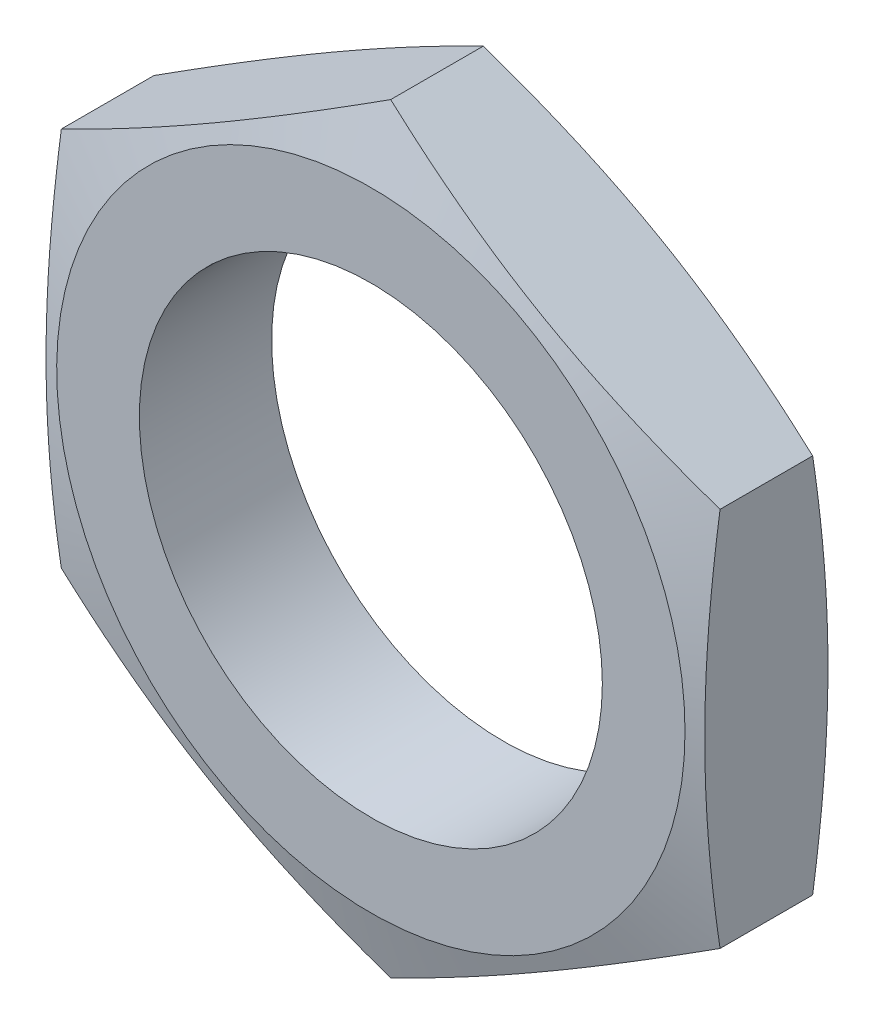
ISO-10303-21;
HEADER;
FILE_DESCRIPTION(('STEP AP214'),'2;1');
FILE_NAME('part.step','',(''),(''),'','','');
FILE_SCHEMA(('AUTOMOTIVE_DESIGN { 1 0 10303 214 1 1 1 1 }'));
ENDSEC;
DATA;
#1=APPLICATION_CONTEXT('core data for automotive mechanical design processes');
#2=APPLICATION_PROTOCOL_DEFINITION('international standard','automotive_design',2000,#1);
#3=PRODUCT_CONTEXT('',#1,'mechanical');
#4=PRODUCT('Part','Part','',(#3));
#5=PRODUCT_RELATED_PRODUCT_CATEGORY('part','',(#4));
#6=PRODUCT_DEFINITION_FORMATION('','',#4);
#7=PRODUCT_DEFINITION_CONTEXT('part definition',#1,'design');
#8=PRODUCT_DEFINITION('design','',#6,#7);
#9=PRODUCT_DEFINITION_SHAPE('','',#8);
#10=(LENGTH_UNIT() NAMED_UNIT(*) SI_UNIT(.MILLI.,.METRE.));
#11=(NAMED_UNIT(*) PLANE_ANGLE_UNIT() SI_UNIT($,.RADIAN.));
#12=(NAMED_UNIT(*) SI_UNIT($,.STERADIAN.) SOLID_ANGLE_UNIT());
#13=UNCERTAINTY_MEASURE_WITH_UNIT(LENGTH_MEASURE(1.E-05),#10,'distance_accuracy_value','');
#14=(GEOMETRIC_REPRESENTATION_CONTEXT(3) GLOBAL_UNCERTAINTY_ASSIGNED_CONTEXT((#13)) GLOBAL_UNIT_ASSIGNED_CONTEXT((#10,
#11,#12)) REPRESENTATION_CONTEXT('',''));
#15=CARTESIAN_POINT('',(0.,0.,0.));
#16=DIRECTION('',(0.,0.,1.));
#17=DIRECTION('',(1.,0.,0.));
#18=AXIS2_PLACEMENT_3D('',#15,#16,#17);
#19=CARTESIAN_POINT('',(15.0572369308232,12.6907672161525,9.1));
#20=DIRECTION('',(0.,0.,1.));
#21=DIRECTION('',(1.,0.,0.));
#22=AXIS2_PLACEMENT_3D('',#19,#20,#21);
#23=CYLINDRICAL_SURFACE('',#22,3.5);
#24=CARTESIAN_POINT('',(15.0572369308232,12.6907672161525,9.1));
#25=DIRECTION('',(0.,0.,1.));
#26=DIRECTION('',(1.,0.,0.));
#27=AXIS2_PLACEMENT_3D('',#24,#25,#26);
#28=CIRCLE('',#27,3.5);
#29=CARTESIAN_POINT('',(18.5572369308232,12.6907672161525,9.1));
#30=VERTEX_POINT('',#29);
#31=EDGE_CURVE('E10',#30,#30,#28,.T.);
#32=ORIENTED_EDGE('',*,*,#31,.T.);
#33=EDGE_LOOP('',(#32));
#34=FACE_BOUND('',#33,.T.);
#35=CARTESIAN_POINT('',(15.0572369308232,12.6907672161525,7.1));
#36=DIRECTION('',(0.,0.,1.));
#37=DIRECTION('',(1.,0.,0.));
#38=AXIS2_PLACEMENT_3D('',#35,#36,#37);
#39=CIRCLE('',#38,3.5);
#40=CARTESIAN_POINT('',(18.5572369308232,12.6907672161525,7.1));
#41=VERTEX_POINT('',#40);
#42=EDGE_CURVE('E94',#41,#41,#39,.T.);
#43=ORIENTED_EDGE('',*,*,#42,.F.);
#44=EDGE_LOOP('',(#43));
#45=FACE_BOUND('',#44,.T.);
#46=ADVANCED_FACE('F16',(#34,#45),#23,.F.);
#47=CARTESIAN_POINT('',(15.0572369308232,12.6907672161525,7.1));
#48=DIRECTION('',(0.,0.,1.));
#49=DIRECTION('',(1.,0.,0.));
#50=AXIS2_PLACEMENT_3D('',#47,#48,#49);
#51=CONICAL_SURFACE('',#50,4.75,1.27933953231703);
#52=CARTESIAN_POINT('',(20.0368830025837,9.81576721615255,7.4));
#53=CARTESIAN_POINT('',(20.0368830025837,10.0543501569726,7.36419951283469));
#54=CARTESIAN_POINT('',(20.0368830025837,10.2934729783412,7.33167882920841));
#55=CARTESIAN_POINT('',(20.0368830025837,10.7727764219852,7.27451936130639));
#56=CARTESIAN_POINT('',(20.0368830025837,11.0129575253882,7.249884642703));
#57=CARTESIAN_POINT('',(20.0368830025837,11.4925566809583,7.20998819620959));
#58=CARTESIAN_POINT('',(20.0368830025837,11.7319696503819,7.19466698976845));
#59=CARTESIAN_POINT('',(20.0368830025837,12.2111775576457,7.17412104518378));
#60=CARTESIAN_POINT('',(20.0368830025837,12.4509723868991,7.16889382152815));
#61=CARTESIAN_POINT('',(20.0368830025837,12.9305620454059,7.16889382152815));
#62=CARTESIAN_POINT('',(20.0368830025837,13.1703568746594,7.17412104518378));
#63=CARTESIAN_POINT('',(20.0368830025837,13.6495647819231,7.19466698976845));
#64=CARTESIAN_POINT('',(20.0368830025837,13.8889777513468,7.20998819620959));
#65=CARTESIAN_POINT('',(20.0368830025837,14.3685769069169,7.249884642703));
#66=CARTESIAN_POINT('',(20.0368830025837,14.6087580103199,7.27451936130639));
#67=CARTESIAN_POINT('',(20.0368830025837,15.0880614539639,7.33167882920841));
#68=CARTESIAN_POINT('',(20.0368830025837,15.3271842753325,7.36419951283469));
#69=CARTESIAN_POINT('',(20.0368830025837,15.5657672161526,7.4));
#70=B_SPLINE_CURVE_WITH_KNOTS('',3,(#52,#53,#54,#55,#56,#57,#58,#59,#60,#61,#62,#63,#64,#65,#66,
#67,#68,#69),.UNSPECIFIED.,.F.,.F.,(4,2,2,2,2,2,2,2,4),(0.,0.723810511300975,1.44799359013895,
2.16750187913838,2.88683297596828,3.60616407279821,4.32567236179767,5.04985544063567,
5.77366595193667),.UNSPECIFIED.);
#71=CARTESIAN_POINT('',(20.0368830025837,9.81576721615255,7.4));
#72=VERTEX_POINT('',#71);
#73=CARTESIAN_POINT('',(20.0368830025837,15.5657672161526,7.4));
#74=VERTEX_POINT('',#73);
#75=EDGE_CURVE('E88',#72,#74,#70,.T.);
#76=ORIENTED_EDGE('',*,*,#75,.F.);
#77=CARTESIAN_POINT('',(15.0572369308232,6.9407672161525,7.4));
#78=CARTESIAN_POINT('',(15.263855818483,7.06005868656255,7.36419951283469));
#79=CARTESIAN_POINT('',(15.4709422564128,7.17962009724684,7.33167882920841));
#80=CARTESIAN_POINT('',(15.8860312147298,7.41927181906883,7.27451936130639));
#81=CARTESIAN_POINT('',(16.0940341517858,7.53936237077034,7.249884642703));
#82=CARTESIAN_POINT('',(16.5093792041431,7.77916194855538,7.20998819620959));
#83=CARTESIAN_POINT('',(16.7167169176594,7.89886843326721,7.19466698976845));
#84=CARTESIAN_POINT('',(17.1317231390442,8.1384723868991,7.17412104518378));
#85=CARTESIAN_POINT('',(17.3393915528739,8.25836980152582,7.16889382152815));
#86=CARTESIAN_POINT('',(17.7547283805331,8.49816463077924,7.16889382152815));
#87=CARTESIAN_POINT('',(17.9623967943627,8.61806204540595,7.17412104518378));
#88=CARTESIAN_POINT('',(18.3774030157475,8.85766599903785,7.19466698976845));
#89=CARTESIAN_POINT('',(18.5847407292639,8.97737248374968,7.20998819620959));
#90=CARTESIAN_POINT('',(19.0000857816211,9.21717206153472,7.249884642703));
#91=CARTESIAN_POINT('',(19.2080887186771,9.33726261323623,7.27451936130639));
#92=CARTESIAN_POINT('',(19.6231776769941,9.57691433505822,7.33167882920841));
#93=CARTESIAN_POINT('',(19.8302641149239,9.69647574574251,7.36419951283469));
#94=CARTESIAN_POINT('',(20.0368830025837,9.81576721615255,7.4));
#95=B_SPLINE_CURVE_WITH_KNOTS('',3,(#77,#78,#79,#80,#81,#82,#83,#84,#85,#86,#87,#88,#89,#90,#91,
#92,#93,#94),.UNSPECIFIED.,.F.,.F.,(4,2,2,2,2,2,2,2,4),(0.,0.723810511300989,1.44799359013897,
2.16750187913842,2.88683297596834,3.60616407279826,4.3256723617977,5.04985544063568,
5.77366595193668),.UNSPECIFIED.);
#96=CARTESIAN_POINT('',(15.0572369308232,6.9407672161525,7.4));
#97=VERTEX_POINT('',#96);
#98=EDGE_CURVE('E100',#97,#72,#95,.T.);
#99=ORIENTED_EDGE('',*,*,#98,.F.);
#100=CARTESIAN_POINT('',(10.0775908590627,9.81576721615248,7.4));
#101=CARTESIAN_POINT('',(10.2842097467225,9.69647574574244,7.36419951283469));
#102=CARTESIAN_POINT('',(10.4912961846522,9.57691433505816,7.33167882920841));
#103=CARTESIAN_POINT('',(10.9063851429693,9.33726261323617,7.27451936130639));
#104=CARTESIAN_POINT('',(11.1143880800253,9.21717206153466,7.249884642703));
#105=CARTESIAN_POINT('',(11.5297331323825,8.97737248374963,7.20998819620959));
#106=CARTESIAN_POINT('',(11.7370708458989,8.8576659990378,7.19466698976845));
#107=CARTESIAN_POINT('',(12.1520770672837,8.61806204540591,7.17412104518378));
#108=CARTESIAN_POINT('',(12.3597454811133,8.4981646307792,7.16889382152815));
#109=CARTESIAN_POINT('',(12.7750823087726,8.25836980152578,7.16889382152815));
#110=CARTESIAN_POINT('',(12.9827507226022,8.13847238689907,7.17412104518378));
#111=CARTESIAN_POINT('',(13.397756943987,7.89886843326718,7.19466698976845));
#112=CARTESIAN_POINT('',(13.6050946575033,7.77916194855536,7.20998819620959));
#113=CARTESIAN_POINT('',(14.0204397098606,7.53936237077032,7.249884642703));
#114=CARTESIAN_POINT('',(14.2284426469166,7.41927181906882,7.27451936130639));
#115=CARTESIAN_POINT('',(14.6435316052336,7.17962009724683,7.33167882920841));
#116=CARTESIAN_POINT('',(14.8506180431634,7.06005868656254,7.36419951283469));
#117=CARTESIAN_POINT('',(15.0572369308232,6.9407672161525,7.4));
#118=B_SPLINE_CURVE_WITH_KNOTS('',3,(#100,#101,#102,#103,#104,#105,#106,#107,#108,#109,#110,
#111,#112,#113,#114,#115,#116,#117),.UNSPECIFIED.,.F.,.F.,(4,2,2,2,2,2,2,2,4),(0.,
0.723810511300987,1.44799359013897,2.16750187913842,2.88683297596834,3.60616407279826,
4.3256723617977,5.04985544063569,5.77366595193667),.UNSPECIFIED.);
#119=CARTESIAN_POINT('',(10.0775908590627,9.81576721615248,7.4));
#120=VERTEX_POINT('',#119);
#121=EDGE_CURVE('E111',#120,#97,#118,.T.);
#122=ORIENTED_EDGE('',*,*,#121,.F.);
#123=CARTESIAN_POINT('',(10.0775908590626,15.5657672161525,7.4));
#124=CARTESIAN_POINT('',(10.0775908590626,15.3271842753324,7.36419951283469));
#125=CARTESIAN_POINT('',(10.0775908590626,15.0880614539638,7.33167882920841));
#126=CARTESIAN_POINT('',(10.0775908590626,14.6087580103199,7.27451936130639));
#127=CARTESIAN_POINT('',(10.0775908590626,14.3685769069169,7.249884642703));
#128=CARTESIAN_POINT('',(10.0775908590626,13.8889777513468,7.20998819620959));
#129=CARTESIAN_POINT('',(10.0775908590626,13.6495647819231,7.19466698976845));
#130=CARTESIAN_POINT('',(10.0775908590627,13.1703568746593,7.17412104518378));
#131=CARTESIAN_POINT('',(10.0775908590627,12.9305620454059,7.16889382152815));
#132=CARTESIAN_POINT('',(10.0775908590627,12.4509723868991,7.16889382152815));
#133=CARTESIAN_POINT('',(10.0775908590627,12.2111775576457,7.17412104518377));
#134=CARTESIAN_POINT('',(10.0775908590627,11.7319696503819,7.19466698976845));
#135=CARTESIAN_POINT('',(10.0775908590627,11.4925566809582,7.20998819620959));
#136=CARTESIAN_POINT('',(10.0775908590627,11.0129575253881,7.249884642703));
#137=CARTESIAN_POINT('',(10.0775908590627,10.7727764219851,7.27451936130639));
#138=CARTESIAN_POINT('',(10.0775908590627,10.2934729783411,7.33167882920841));
#139=CARTESIAN_POINT('',(10.0775908590627,10.0543501569726,7.36419951283469));
#140=CARTESIAN_POINT('',(10.0775908590627,9.81576721615248,7.4));
#141=B_SPLINE_CURVE_WITH_KNOTS('',3,(#123,#124,#125,#126,#127,#128,#129,#130,#131,#132,#133,
#134,#135,#136,#137,#138,#139,#140),.UNSPECIFIED.,.F.,.F.,(4,2,2,2,2,2,2,2,4),(0.,
0.723810511300984,1.44799359013896,2.1675018791384,2.88683297596831,3.60616407279824,
4.32567236179769,5.04985544063568,5.77366595193667),.UNSPECIFIED.);
#142=CARTESIAN_POINT('',(10.0775908590626,15.5657672161525,7.4));
#143=VERTEX_POINT('',#142);
#144=EDGE_CURVE('E116',#143,#120,#141,.T.);
#145=ORIENTED_EDGE('',*,*,#144,.F.);
#146=CARTESIAN_POINT('',(15.0572369308232,18.4407672161525,7.4));
#147=CARTESIAN_POINT('',(14.8506180431634,18.3214757457425,7.36419951283469));
#148=CARTESIAN_POINT('',(14.6435316052336,18.2019143350582,7.33167882920841));
#149=CARTESIAN_POINT('',(14.2284426469165,17.9622626132362,7.27451936130639));
#150=CARTESIAN_POINT('',(14.0204397098606,17.8421720615347,7.249884642703));
#151=CARTESIAN_POINT('',(13.6050946575033,17.6023724837496,7.20998819620959));
#152=CARTESIAN_POINT('',(13.3977569439869,17.4826659990378,7.19466698976845));
#153=CARTESIAN_POINT('',(12.9827507226021,17.2430620454059,7.17412104518377));
#154=CARTESIAN_POINT('',(12.7750823087725,17.1231646307792,7.16889382152815));
#155=CARTESIAN_POINT('',(12.3597454811133,16.8833698015258,7.16889382152815));
#156=CARTESIAN_POINT('',(12.1520770672837,16.7634723868991,7.17412104518377));
#157=CARTESIAN_POINT('',(11.7370708458989,16.5238684332672,7.19466698976845));
#158=CARTESIAN_POINT('',(11.5297331323825,16.4041619485554,7.20998819620959));
#159=CARTESIAN_POINT('',(11.1143880800253,16.1643623707703,7.249884642703));
#160=CARTESIAN_POINT('',(10.9063851429693,16.0442718190688,7.27451936130639));
#161=CARTESIAN_POINT('',(10.4912961846522,15.8046200972468,7.33167882920841));
#162=CARTESIAN_POINT('',(10.2842097467224,15.6850586865625,7.36419951283469));
#163=CARTESIAN_POINT('',(10.0775908590626,15.5657672161525,7.4));
#164=B_SPLINE_CURVE_WITH_KNOTS('',3,(#146,#147,#148,#149,#150,#151,#152,#153,#154,#155,#156,
#157,#158,#159,#160,#161,#162,#163),.UNSPECIFIED.,.F.,.F.,(4,2,2,2,2,2,2,2,4),(0.,
0.723810511300988,1.44799359013897,2.16750187913842,2.88683297596833,3.60616407279826,
4.3256723617977,5.04985544063569,5.77366595193667),.UNSPECIFIED.);
#165=CARTESIAN_POINT('',(15.0572369308232,18.4407672161525,7.4));
#166=VERTEX_POINT('',#165);
#167=EDGE_CURVE('E21',#166,#143,#164,.T.);
#168=ORIENTED_EDGE('',*,*,#167,.F.);
#169=CARTESIAN_POINT('',(20.0368830025837,15.5657672161526,7.4));
#170=CARTESIAN_POINT('',(19.8302641149239,15.6850586865626,7.36419951283469));
#171=CARTESIAN_POINT('',(19.6231776769941,15.8046200972469,7.33167882920841));
#172=CARTESIAN_POINT('',(19.208088718677,16.0442718190689,7.27451936130639));
#173=CARTESIAN_POINT('',(19.000085781621,16.1643623707704,7.24988464270301));
#174=CARTESIAN_POINT('',(18.5847407292638,16.4041619485554,7.2099881962096));
#175=CARTESIAN_POINT('',(18.3774030157474,16.5238684332672,7.19466698976845));
#176=CARTESIAN_POINT('',(17.9623967943626,16.7634723868991,7.17412104518378));
#177=CARTESIAN_POINT('',(17.754728380533,16.8833698015258,7.16889382152816));
#178=CARTESIAN_POINT('',(17.3393915528738,17.1231646307792,7.16889382152816));
#179=CARTESIAN_POINT('',(17.1317231390442,17.2430620454059,7.17412104518378));
#180=CARTESIAN_POINT('',(16.7167169176594,17.4826659990378,7.19466698976845));
#181=CARTESIAN_POINT('',(16.509379204143,17.6023724837497,7.2099881962096));
#182=CARTESIAN_POINT('',(16.0940341517858,17.8421720615347,7.24988464270301));
#183=CARTESIAN_POINT('',(15.8860312147298,17.9622626132362,7.27451936130639));
#184=CARTESIAN_POINT('',(15.4709422564127,18.2019143350582,7.33167882920841));
#185=CARTESIAN_POINT('',(15.263855818483,18.3214757457425,7.36419951283469));
#186=CARTESIAN_POINT('',(15.0572369308232,18.4407672161525,7.4));
#187=B_SPLINE_CURVE_WITH_KNOTS('',3,(#169,#170,#171,#172,#173,#174,#175,#176,#177,#178,#179,
#180,#181,#182,#183,#184,#185,#186),.UNSPECIFIED.,.F.,.F.,(4,2,2,2,2,2,2,2,4),(0.,
0.723810511300977,1.44799359013895,2.16750187913839,2.8868329759683,3.60616407279821,
4.32567236179765,5.04985544063563,5.7736659519366),.UNSPECIFIED.);
#188=EDGE_CURVE('E95',#74,#166,#187,.T.);
#189=ORIENTED_EDGE('',*,*,#188,.F.);
#190=EDGE_LOOP('',(#76,#99,#122,#145,#168,#189));
#191=FACE_BOUND('',#190,.T.);
#192=CARTESIAN_POINT('',(15.0572369308232,12.6907672161525,7.1));
#193=DIRECTION('',(0.,0.,1.));
#194=DIRECTION('',(1.,0.,0.));
#195=AXIS2_PLACEMENT_3D('',#192,#193,#194);
#196=CIRCLE('',#195,4.75);
#197=CARTESIAN_POINT('',(19.8072369308232,12.6907672161525,7.1));
#198=VERTEX_POINT('',#197);
#199=EDGE_CURVE('E30',#198,#198,#196,.T.);
#200=ORIENTED_EDGE('',*,*,#199,.T.);
#201=EDGE_LOOP('',(#200));
#202=FACE_BOUND('',#201,.T.);
#203=ADVANCED_FACE('F135',(#191,#202),#51,.T.);
#204=CARTESIAN_POINT('',(15.0572369308232,12.6907672161525,8.8));
#205=DIRECTION('',(0.,0.,-1.));
#206=DIRECTION('',(-1.,0.,0.));
#207=AXIS2_PLACEMENT_3D('',#204,#205,#206);
#208=CONICAL_SURFACE('',#207,5.75,1.27933953231703);
#209=CARTESIAN_POINT('',(10.0775908590627,9.81576721615248,8.8));
#210=CARTESIAN_POINT('',(10.0775908590627,10.0543501569726,8.8358004871653));
#211=CARTESIAN_POINT('',(10.0775908590627,10.2934729783411,8.86832117079158));
#212=CARTESIAN_POINT('',(10.0775908590627,10.7727764219851,8.9254806386936));
#213=CARTESIAN_POINT('',(10.0775908590627,11.0129575253881,8.95011535729699));
#214=CARTESIAN_POINT('',(10.0775908590627,11.4925566809582,8.9900118037904));
#215=CARTESIAN_POINT('',(10.0775908590627,11.7319696503819,9.00533301023155));
#216=CARTESIAN_POINT('',(10.0775908590627,12.2111775576457,9.02587895481622));
#217=CARTESIAN_POINT('',(10.0775908590627,12.4509723868991,9.03110617847184));
#218=CARTESIAN_POINT('',(10.0775908590627,12.9305620454059,9.03110617847184));
#219=CARTESIAN_POINT('',(10.0775908590627,13.1703568746593,9.02587895481622));
#220=CARTESIAN_POINT('',(10.0775908590626,13.6495647819231,9.00533301023154));
#221=CARTESIAN_POINT('',(10.0775908590626,13.8889777513468,8.9900118037904));
#222=CARTESIAN_POINT('',(10.0775908590626,14.3685769069168,8.95011535729699));
#223=CARTESIAN_POINT('',(10.0775908590626,14.6087580103199,8.9254806386936));
#224=CARTESIAN_POINT('',(10.0775908590626,15.0880614539638,8.86832117079158));
#225=CARTESIAN_POINT('',(10.0775908590626,15.3271842753324,8.8358004871653));
#226=CARTESIAN_POINT('',(10.0775908590626,15.5657672161525,8.8));
#227=B_SPLINE_CURVE_WITH_KNOTS('',3,(#209,#210,#211,#212,#213,#214,#215,#216,#217,#218,#219,
#220,#221,#222,#223,#224,#225,#226),.UNSPECIFIED.,.F.,.F.,(4,2,2,2,2,2,2,2,4),(0.,
0.723810511300993,1.44799359013898,2.16750187913843,2.88683297596835,3.60616407279827,
4.3256723617977,5.04985544063569,5.77366595193667),.UNSPECIFIED.);
#228=CARTESIAN_POINT('',(10.0775908590627,9.81576721615248,8.8));
#229=VERTEX_POINT('',#228);
#230=CARTESIAN_POINT('',(10.0775908590626,15.5657672161525,8.8));
#231=VERTEX_POINT('',#230);
#232=EDGE_CURVE('E112',#229,#231,#227,.T.);
#233=ORIENTED_EDGE('',*,*,#232,.F.);
#234=CARTESIAN_POINT('',(15.0572369308232,6.9407672161525,8.8));
#235=CARTESIAN_POINT('',(14.8506180431634,7.06005868656254,8.8358004871653));
#236=CARTESIAN_POINT('',(14.6435316052336,7.17962009724683,8.86832117079158));
#237=CARTESIAN_POINT('',(14.2284426469166,7.41927181906882,8.9254806386936));
#238=CARTESIAN_POINT('',(14.0204397098606,7.53936237077032,8.95011535729699));
#239=CARTESIAN_POINT('',(13.6050946575033,7.77916194855536,8.9900118037904));
#240=CARTESIAN_POINT('',(13.397756943987,7.89886843326719,9.00533301023154));
#241=CARTESIAN_POINT('',(12.9827507226022,8.13847238689908,9.02587895481622));
#242=CARTESIAN_POINT('',(12.7750823087726,8.25836980152578,9.03110617847184));
#243=CARTESIAN_POINT('',(12.3597454811133,8.4981646307792,9.03110617847184));
#244=CARTESIAN_POINT('',(12.1520770672837,8.61806204540591,9.02587895481622));
#245=CARTESIAN_POINT('',(11.7370708458989,8.8576659990378,9.00533301023154));
#246=CARTESIAN_POINT('',(11.5297331323825,8.97737248374962,8.9900118037904));
#247=CARTESIAN_POINT('',(11.1143880800253,9.21717206153466,8.95011535729699));
#248=CARTESIAN_POINT('',(10.9063851429693,9.33726261323617,8.9254806386936));
#249=CARTESIAN_POINT('',(10.4912961846522,9.57691433505815,8.86832117079158));
#250=CARTESIAN_POINT('',(10.2842097467225,9.69647574574244,8.8358004871653));
#251=CARTESIAN_POINT('',(10.0775908590627,9.81576721615248,8.8));
#252=B_SPLINE_CURVE_WITH_KNOTS('',3,(#234,#235,#236,#237,#238,#239,#240,#241,#242,#243,#244,
#245,#246,#247,#248,#249,#250,#251),.UNSPECIFIED.,.F.,.F.,(4,2,2,2,2,2,2,2,4),(0.,
0.723810511300989,1.44799359013897,2.16750187913842,2.88683297596834,3.60616407279825,
4.32567236179769,5.04985544063568,5.77366595193667),.UNSPECIFIED.);
#253=CARTESIAN_POINT('',(15.0572369308232,6.9407672161525,8.8));
#254=VERTEX_POINT('',#253);
#255=EDGE_CURVE('E107',#254,#229,#252,.T.);
#256=ORIENTED_EDGE('',*,*,#255,.F.);
#257=CARTESIAN_POINT('',(20.0368830025837,9.81576721615255,8.8));
#258=CARTESIAN_POINT('',(19.8302641149239,9.69647574574251,8.8358004871653));
#259=CARTESIAN_POINT('',(19.6231776769941,9.57691433505822,8.86832117079158));
#260=CARTESIAN_POINT('',(19.2080887186771,9.33726261323623,8.9254806386936));
#261=CARTESIAN_POINT('',(19.0000857816211,9.21717206153472,8.95011535729699));
#262=CARTESIAN_POINT('',(18.5847407292639,8.97737248374968,8.9900118037904));
#263=CARTESIAN_POINT('',(18.3774030157475,8.85766599903785,9.00533301023154));
#264=CARTESIAN_POINT('',(17.9623967943627,8.61806204540595,9.02587895481622));
#265=CARTESIAN_POINT('',(17.7547283805331,8.49816463077924,9.03110617847184));
#266=CARTESIAN_POINT('',(17.3393915528739,8.25836980152582,9.03110617847184));
#267=CARTESIAN_POINT('',(17.1317231390442,8.13847238689911,9.02587895481622));
#268=CARTESIAN_POINT('',(16.7167169176594,7.89886843326721,9.00533301023154));
#269=CARTESIAN_POINT('',(16.5093792041431,7.77916194855538,8.9900118037904));
#270=CARTESIAN_POINT('',(16.0940341517858,7.53936237077034,8.95011535729699));
#271=CARTESIAN_POINT('',(15.8860312147298,7.41927181906883,8.9254806386936));
#272=CARTESIAN_POINT('',(15.4709422564128,7.17962009724684,8.86832117079158));
#273=CARTESIAN_POINT('',(15.263855818483,7.06005868656255,8.8358004871653));
#274=CARTESIAN_POINT('',(15.0572369308232,6.9407672161525,8.8));
#275=B_SPLINE_CURVE_WITH_KNOTS('',3,(#257,#258,#259,#260,#261,#262,#263,#264,#265,#266,#267,
#268,#269,#270,#271,#272,#273,#274),.UNSPECIFIED.,.F.,.F.,(4,2,2,2,2,2,2,2,4),(0.,
0.723810511300987,1.44799359013897,2.16750187913842,2.88683297596834,3.60616407279825,
4.3256723617977,5.04985544063569,5.77366595193667),.UNSPECIFIED.);
#276=CARTESIAN_POINT('',(20.0368830025837,9.81576721615255,8.8));
#277=VERTEX_POINT('',#276);
#278=EDGE_CURVE('E82',#277,#254,#275,.T.);
#279=ORIENTED_EDGE('',*,*,#278,.F.);
#280=CARTESIAN_POINT('',(20.0368830025837,15.5657672161526,8.8));
#281=CARTESIAN_POINT('',(20.0368830025837,15.3271842753325,8.8358004871653));
#282=CARTESIAN_POINT('',(20.0368830025837,15.0880614539639,8.86832117079158));
#283=CARTESIAN_POINT('',(20.0368830025837,14.6087580103199,8.9254806386936));
#284=CARTESIAN_POINT('',(20.0368830025837,14.3685769069169,8.95011535729699));
#285=CARTESIAN_POINT('',(20.0368830025837,13.8889777513468,8.9900118037904));
#286=CARTESIAN_POINT('',(20.0368830025837,13.6495647819231,9.00533301023154));
#287=CARTESIAN_POINT('',(20.0368830025837,13.1703568746594,9.02587895481622));
#288=CARTESIAN_POINT('',(20.0368830025837,12.9305620454059,9.03110617847184));
#289=CARTESIAN_POINT('',(20.0368830025837,12.4509723868991,9.03110617847184));
#290=CARTESIAN_POINT('',(20.0368830025837,12.2111775576457,9.02587895481621));
#291=CARTESIAN_POINT('',(20.0368830025837,11.7319696503819,9.00533301023154));
#292=CARTESIAN_POINT('',(20.0368830025837,11.4925566809582,8.9900118037904));
#293=CARTESIAN_POINT('',(20.0368830025837,11.0129575253882,8.95011535729699));
#294=CARTESIAN_POINT('',(20.0368830025837,10.7727764219852,8.9254806386936));
#295=CARTESIAN_POINT('',(20.0368830025837,10.2934729783412,8.86832117079158));
#296=CARTESIAN_POINT('',(20.0368830025837,10.0543501569726,8.8358004871653));
#297=CARTESIAN_POINT('',(20.0368830025837,9.81576721615255,8.8));
#298=B_SPLINE_CURVE_WITH_KNOTS('',3,(#280,#281,#282,#283,#284,#285,#286,#287,#288,#289,#290,
#291,#292,#293,#294,#295,#296,#297),.UNSPECIFIED.,.F.,.F.,(4,2,2,2,2,2,2,2,4),(0.,
0.723810511301001,1.447993590139,2.16750187913846,2.88683297596838,3.60616407279829,
4.32567236179772,5.04985544063569,5.77366595193667),.UNSPECIFIED.);
#299=CARTESIAN_POINT('',(20.0368830025837,15.5657672161526,8.8));
#300=VERTEX_POINT('',#299);
#301=EDGE_CURVE('E75',#300,#277,#298,.T.);
#302=ORIENTED_EDGE('',*,*,#301,.F.);
#303=CARTESIAN_POINT('',(15.0572369308232,18.4407672161525,8.8));
#304=CARTESIAN_POINT('',(15.263855818483,18.3214757457425,8.8358004871653));
#305=CARTESIAN_POINT('',(15.4709422564127,18.2019143350582,8.86832117079158));
#306=CARTESIAN_POINT('',(15.8860312147298,17.9622626132362,8.9254806386936));
#307=CARTESIAN_POINT('',(16.0940341517858,17.8421720615347,8.95011535729699));
#308=CARTESIAN_POINT('',(16.509379204143,17.6023724837497,8.9900118037904));
#309=CARTESIAN_POINT('',(16.7167169176594,17.4826659990378,9.00533301023154));
#310=CARTESIAN_POINT('',(17.1317231390442,17.2430620454059,9.02587895481621));
#311=CARTESIAN_POINT('',(17.3393915528738,17.1231646307792,9.03110617847184));
#312=CARTESIAN_POINT('',(17.754728380533,16.8833698015258,9.03110617847184));
#313=CARTESIAN_POINT('',(17.9623967943626,16.7634723868991,9.02587895481621));
#314=CARTESIAN_POINT('',(18.3774030157475,16.5238684332672,9.00533301023154));
#315=CARTESIAN_POINT('',(18.5847407292638,16.4041619485554,8.9900118037904));
#316=CARTESIAN_POINT('',(19.000085781621,16.1643623707704,8.95011535729699));
#317=CARTESIAN_POINT('',(19.208088718677,16.0442718190689,8.9254806386936));
#318=CARTESIAN_POINT('',(19.6231776769941,15.8046200972469,8.86832117079158));
#319=CARTESIAN_POINT('',(19.8302641149239,15.6850586865626,8.8358004871653));
#320=CARTESIAN_POINT('',(20.0368830025837,15.5657672161526,8.8));
#321=B_SPLINE_CURVE_WITH_KNOTS('',3,(#303,#304,#305,#306,#307,#308,#309,#310,#311,#312,#313,
#314,#315,#316,#317,#318,#319,#320),.UNSPECIFIED.,.F.,.F.,(4,2,2,2,2,2,2,2,4),(0.,
0.723810511300977,1.44799359013895,2.16750187913839,2.8868329759683,3.60616407279821,
4.32567236179765,5.04985544063562,5.7736659519366),.UNSPECIFIED.);
#322=CARTESIAN_POINT('',(15.0572369308232,18.4407672161525,8.8));
#323=VERTEX_POINT('',#322);
#324=EDGE_CURVE('E79',#323,#300,#321,.T.);
#325=ORIENTED_EDGE('',*,*,#324,.F.);
#326=CARTESIAN_POINT('',(10.0775908590626,15.5657672161525,8.8));
#327=CARTESIAN_POINT('',(10.2842097467224,15.6850586865625,8.8358004871653));
#328=CARTESIAN_POINT('',(10.4912961846522,15.8046200972468,8.86832117079159));
#329=CARTESIAN_POINT('',(10.9063851429693,16.0442718190688,8.92548063869361));
#330=CARTESIAN_POINT('',(11.1143880800253,16.1643623707703,8.95011535729699));
#331=CARTESIAN_POINT('',(11.5297331323825,16.4041619485554,8.9900118037904));
#332=CARTESIAN_POINT('',(11.7370708458989,16.5238684332672,9.00533301023155));
#333=CARTESIAN_POINT('',(12.1520770672837,16.7634723868991,9.02587895481622));
#334=CARTESIAN_POINT('',(12.3597454811133,16.8833698015258,9.03110617847184));
#335=CARTESIAN_POINT('',(12.7750823087725,17.1231646307792,9.03110617847184));
#336=CARTESIAN_POINT('',(12.9827507226021,17.2430620454059,9.02587895481622));
#337=CARTESIAN_POINT('',(13.3977569439869,17.4826659990378,9.00533301023155));
#338=CARTESIAN_POINT('',(13.6050946575033,17.6023724837496,8.9900118037904));
#339=CARTESIAN_POINT('',(14.0204397098605,17.8421720615347,8.95011535729699));
#340=CARTESIAN_POINT('',(14.2284426469165,17.9622626132362,8.92548063869361));
#341=CARTESIAN_POINT('',(14.6435316052336,18.2019143350582,8.86832117079159));
#342=CARTESIAN_POINT('',(14.8506180431634,18.3214757457425,8.8358004871653));
#343=CARTESIAN_POINT('',(15.0572369308232,18.4407672161525,8.8));
#344=B_SPLINE_CURVE_WITH_KNOTS('',3,(#326,#327,#328,#329,#330,#331,#332,#333,#334,#335,#336,
#337,#338,#339,#340,#341,#342,#343),.UNSPECIFIED.,.F.,.F.,(4,2,2,2,2,2,2,2,4),(0.,
0.723810511300988,1.44799359013897,2.16750187913841,2.88683297596833,3.60616407279825,
4.32567236179769,5.04985544063567,5.77366595193667),.UNSPECIFIED.);
#345=EDGE_CURVE('E117',#231,#323,#344,.T.);
#346=ORIENTED_EDGE('',*,*,#345,.F.);
#347=EDGE_LOOP('',(#233,#256,#279,#302,#325,#346));
#348=FACE_BOUND('',#347,.T.);
#349=CARTESIAN_POINT('',(15.0572369308232,12.6907672161525,9.1));
#350=DIRECTION('',(0.,0.,1.));
#351=DIRECTION('',(1.,0.,0.));
#352=AXIS2_PLACEMENT_3D('',#349,#350,#351);
#353=CIRCLE('',#352,4.75);
#354=CARTESIAN_POINT('',(19.8072369308232,12.6907672161525,9.1));
#355=VERTEX_POINT('',#354);
#356=EDGE_CURVE('E213',#355,#355,#353,.T.);
#357=ORIENTED_EDGE('',*,*,#356,.F.);
#358=EDGE_LOOP('',(#357));
#359=FACE_BOUND('',#358,.T.);
#360=ADVANCED_FACE('F77',(#348,#359),#208,.T.);
#361=CARTESIAN_POINT('',(15.0572369308232,16.1907672161525,9.1));
#362=DIRECTION('',(0.,0.,-1.));
#363=DIRECTION('',(-1.,0.,0.));
#364=AXIS2_PLACEMENT_3D('',#361,#362,#363);
#365=PLANE('',#364);
#366=ORIENTED_EDGE('',*,*,#31,.F.);
#367=EDGE_LOOP('',(#366));
#368=FACE_BOUND('',#367,.T.);
#369=ORIENTED_EDGE('',*,*,#356,.T.);
#370=EDGE_LOOP('',(#369));
#371=FACE_BOUND('',#370,.T.);
#372=ADVANCED_FACE('F134',(#368,#371),#365,.F.);
#373=CARTESIAN_POINT('',(15.0572369308232,17.4407672161525,7.1));
#374=DIRECTION('',(0.,0.,1.));
#375=DIRECTION('',(1.,0.,0.));
#376=AXIS2_PLACEMENT_3D('',#373,#374,#375);
#377=PLANE('',#376);
#378=ORIENTED_EDGE('',*,*,#199,.F.);
#379=EDGE_LOOP('',(#378));
#380=FACE_BOUND('',#379,.T.);
#381=ORIENTED_EDGE('',*,*,#42,.T.);
#382=EDGE_LOOP('',(#381));
#383=FACE_BOUND('',#382,.T.);
#384=ADVANCED_FACE('F220',(#380,#383),#377,.F.);
#385=CARTESIAN_POINT('',(20.0368830025837,15.5657672161526,-0.900000000000003));
#386=DIRECTION('',(0.499999999999995,0.866025403784442,0.));
#387=DIRECTION('',(-0.866025403784442,0.499999999999995,0.));
#388=AXIS2_PLACEMENT_3D('',#385,#386,#387);
#389=PLANE('',#388);
#390=ORIENTED_EDGE('',*,*,#324,.T.);
#391=DIRECTION('',(0.,0.,1.));
#392=VECTOR('',#391,1.);
#393=CARTESIAN_POINT('',(20.0368830025837,15.5657672161526,-0.900000000000003));
#394=LINE('',#393,#392);
#395=EDGE_CURVE('E93',#74,#300,#394,.T.);
#396=ORIENTED_EDGE('',*,*,#395,.F.);
#397=ORIENTED_EDGE('',*,*,#188,.T.);
#398=DIRECTION('',(0.,0.,1.));
#399=VECTOR('',#398,1.);
#400=CARTESIAN_POINT('',(15.0572369308232,18.4407672161525,-0.900000000000003));
#401=LINE('',#400,#399);
#402=EDGE_CURVE('E87',#166,#323,#401,.T.);
#403=ORIENTED_EDGE('',*,*,#402,.T.);
#404=EDGE_LOOP('',(#390,#396,#397,#403));
#405=FACE_BOUND('',#404,.T.);
#406=ADVANCED_FACE('F92',(#405),#389,.T.);
#407=CARTESIAN_POINT('',(20.0368830025837,9.81576721615255,-0.900000000000003));
#408=DIRECTION('',(1.,0.,0.));
#409=DIRECTION('',(0.,1.,0.));
#410=AXIS2_PLACEMENT_3D('',#407,#408,#409);
#411=PLANE('',#410);
#412=ORIENTED_EDGE('',*,*,#301,.T.);
#413=DIRECTION('',(0.,0.,1.));
#414=VECTOR('',#413,1.);
#415=CARTESIAN_POINT('',(20.0368830025837,9.81576721615255,-0.900000000000003));
#416=LINE('',#415,#414);
#417=EDGE_CURVE('E105',#72,#277,#416,.T.);
#418=ORIENTED_EDGE('',*,*,#417,.F.);
#419=ORIENTED_EDGE('',*,*,#75,.T.);
#420=ORIENTED_EDGE('',*,*,#395,.T.);
#421=EDGE_LOOP('',(#412,#418,#419,#420));
#422=FACE_BOUND('',#421,.T.);
#423=ADVANCED_FACE('F97',(#422),#411,.T.);
#424=CARTESIAN_POINT('',(15.0572369308232,6.9407672161525,-0.900000000000003));
#425=DIRECTION('',(0.500000000000007,-0.866025403784435,0.));
#426=DIRECTION('',(0.866025403784435,0.500000000000007,0.));
#427=AXIS2_PLACEMENT_3D('',#424,#425,#426);
#428=PLANE('',#427);
#429=ORIENTED_EDGE('',*,*,#278,.T.);
#430=DIRECTION('',(0.,0.,1.));
#431=VECTOR('',#430,1.);
#432=CARTESIAN_POINT('',(15.0572369308232,6.9407672161525,-0.900000000000003));
#433=LINE('',#432,#431);
#434=EDGE_CURVE('E108',#97,#254,#433,.T.);
#435=ORIENTED_EDGE('',*,*,#434,.F.);
#436=ORIENTED_EDGE('',*,*,#98,.T.);
#437=ORIENTED_EDGE('',*,*,#417,.T.);
#438=EDGE_LOOP('',(#429,#435,#436,#437));
#439=FACE_BOUND('',#438,.T.);
#440=ADVANCED_FACE('F177',(#439),#428,.T.);
#441=CARTESIAN_POINT('',(10.0775908590627,9.81576721615248,-0.900000000000003));
#442=DIRECTION('',(-0.499999999999995,-0.866025403784442,0.));
#443=DIRECTION('',(0.866025403784442,-0.499999999999995,0.));
#444=AXIS2_PLACEMENT_3D('',#441,#442,#443);
#445=PLANE('',#444);
#446=ORIENTED_EDGE('',*,*,#255,.T.);
#447=DIRECTION('',(0.,0.,1.));
#448=VECTOR('',#447,1.);
#449=CARTESIAN_POINT('',(10.0775908590627,9.81576721615248,-0.900000000000003));
#450=LINE('',#449,#448);
#451=EDGE_CURVE('E113',#120,#229,#450,.T.);
#452=ORIENTED_EDGE('',*,*,#451,.F.);
#453=ORIENTED_EDGE('',*,*,#121,.T.);
#454=ORIENTED_EDGE('',*,*,#434,.T.);
#455=EDGE_LOOP('',(#446,#452,#453,#454));
#456=FACE_BOUND('',#455,.T.);
#457=ADVANCED_FACE('F172',(#456),#445,.T.);
#458=CARTESIAN_POINT('',(10.0775908590626,15.5657672161525,-0.900000000000003));
#459=DIRECTION('',(-1.,0.,0.));
#460=DIRECTION('',(0.,-1.,0.));
#461=AXIS2_PLACEMENT_3D('',#458,#459,#460);
#462=PLANE('',#461);
#463=ORIENTED_EDGE('',*,*,#451,.T.);
#464=ORIENTED_EDGE('',*,*,#232,.T.);
#465=DIRECTION('',(0.,0.,1.));
#466=VECTOR('',#465,1.);
#467=CARTESIAN_POINT('',(10.0775908590626,15.5657672161525,-0.900000000000003));
#468=LINE('',#467,#466);
#469=EDGE_CURVE('E118',#143,#231,#468,.T.);
#470=ORIENTED_EDGE('',*,*,#469,.F.);
#471=ORIENTED_EDGE('',*,*,#144,.T.);
#472=EDGE_LOOP('',(#463,#464,#470,#471));
#473=FACE_BOUND('',#472,.T.);
#474=ADVANCED_FACE('F169',(#473),#462,.T.);
#475=CARTESIAN_POINT('',(15.0572369308232,18.4407672161525,-0.900000000000003));
#476=DIRECTION('',(-0.500000000000001,0.866025403784438,0.));
#477=DIRECTION('',(-0.866025403784438,-0.500000000000001,0.));
#478=AXIS2_PLACEMENT_3D('',#475,#476,#477);
#479=PLANE('',#478);
#480=ORIENTED_EDGE('',*,*,#345,.T.);
#481=ORIENTED_EDGE('',*,*,#402,.F.);
#482=ORIENTED_EDGE('',*,*,#167,.T.);
#483=ORIENTED_EDGE('',*,*,#469,.T.);
#484=EDGE_LOOP('',(#480,#481,#482,#483));
#485=FACE_BOUND('',#484,.T.);
#486=ADVANCED_FACE('F18',(#485),#479,.T.);
#487=CLOSED_SHELL('',(#46,#203,#360,#372,#384,#406,#423,#440,#457,#474,#486));
#488=MANIFOLD_SOLID_BREP('B1',#487);
#489=ADVANCED_BREP_SHAPE_REPRESENTATION('',(#18,#488),#14);
#490=SHAPE_DEFINITION_REPRESENTATION(#9,#489);
ENDSEC;
END-ISO-10303-21;
